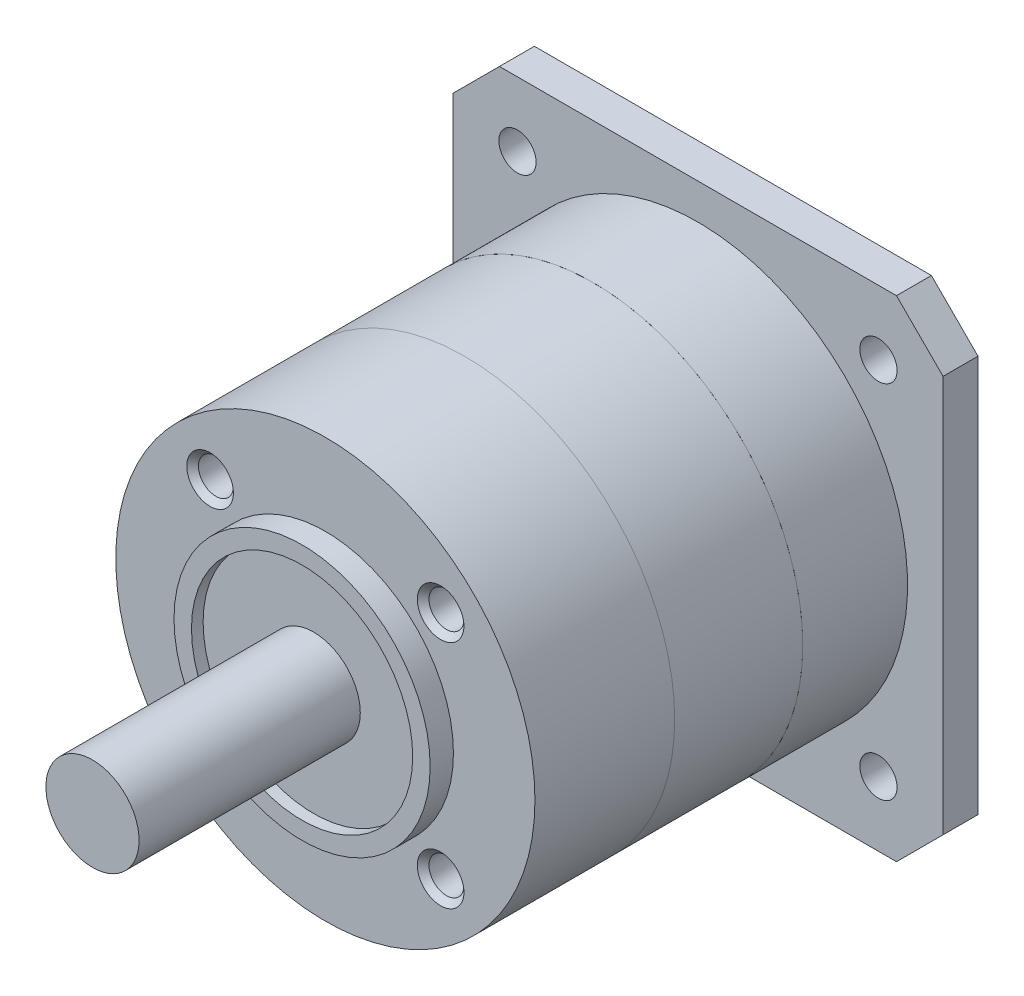
ISO-10303-21;
HEADER;
FILE_DESCRIPTION(('STEP AP214'),'2;1');
FILE_NAME('part.step','',(''),(''),'','','');
FILE_SCHEMA(('AUTOMOTIVE_DESIGN { 1 0 10303 214 1 1 1 1 }'));
ENDSEC;
DATA;
#1=APPLICATION_CONTEXT('core data for automotive mechanical design processes');
#2=APPLICATION_PROTOCOL_DEFINITION('international standard','automotive_design',2000,#1);
#3=PRODUCT_CONTEXT('',#1,'mechanical');
#4=PRODUCT('Part','Part','',(#3));
#5=PRODUCT_RELATED_PRODUCT_CATEGORY('part','',(#4));
#6=PRODUCT_DEFINITION_FORMATION('','',#4);
#7=PRODUCT_DEFINITION_CONTEXT('part definition',#1,'design');
#8=PRODUCT_DEFINITION('design','',#6,#7);
#9=PRODUCT_DEFINITION_SHAPE('','',#8);
#10=(LENGTH_UNIT() NAMED_UNIT(*) SI_UNIT(.MILLI.,.METRE.));
#11=(NAMED_UNIT(*) PLANE_ANGLE_UNIT() SI_UNIT($,.RADIAN.));
#12=(NAMED_UNIT(*) SI_UNIT($,.STERADIAN.) SOLID_ANGLE_UNIT());
#13=UNCERTAINTY_MEASURE_WITH_UNIT(LENGTH_MEASURE(1.E-05),#10,'distance_accuracy_value','');
#14=(GEOMETRIC_REPRESENTATION_CONTEXT(3) GLOBAL_UNCERTAINTY_ASSIGNED_CONTEXT((#13)) GLOBAL_UNIT_ASSIGNED_CONTEXT((#10,
#11,#12)) REPRESENTATION_CONTEXT('',''));
#15=CARTESIAN_POINT('',(0.,0.,0.));
#16=DIRECTION('',(0.,0.,1.));
#17=DIRECTION('',(1.,0.,0.));
#18=AXIS2_PLACEMENT_3D('',#15,#16,#17);
#19=CARTESIAN_POINT('',(0.,0.,55.));
#20=DIRECTION('',(0.,0.,-1.));
#21=DIRECTION('',(-1.,0.,0.));
#22=AXIS2_PLACEMENT_3D('',#19,#20,#21);
#23=CYLINDRICAL_SURFACE('',#22,4.);
#24=CARTESIAN_POINT('',(0.,0.,55.));
#25=DIRECTION('',(0.,0.,1.));
#26=DIRECTION('',(1.,0.,0.));
#27=AXIS2_PLACEMENT_3D('',#24,#25,#26);
#28=CIRCLE('',#27,4.);
#29=CARTESIAN_POINT('',(4.,0.,55.));
#30=VERTEX_POINT('',#29);
#31=EDGE_CURVE('E11',#30,#30,#28,.T.);
#32=ORIENTED_EDGE('',*,*,#31,.F.);
#33=EDGE_LOOP('',(#32));
#34=FACE_BOUND('',#33,.T.);
#35=CARTESIAN_POINT('',(0.,0.,35.));
#36=DIRECTION('',(0.,0.,1.));
#37=DIRECTION('',(1.,0.,0.));
#38=AXIS2_PLACEMENT_3D('',#35,#36,#37);
#39=CIRCLE('',#38,4.);
#40=CARTESIAN_POINT('',(4.,0.,35.));
#41=VERTEX_POINT('',#40);
#42=EDGE_CURVE('E49',#41,#41,#39,.T.);
#43=ORIENTED_EDGE('',*,*,#42,.T.);
#44=EDGE_LOOP('',(#43));
#45=FACE_BOUND('',#44,.T.);
#46=ADVANCED_FACE('F46',(#34,#45),#23,.T.);
#47=CARTESIAN_POINT('',(0.,0.,55.));
#48=DIRECTION('',(0.,0.,1.));
#49=DIRECTION('',(1.,0.,0.));
#50=AXIS2_PLACEMENT_3D('',#47,#48,#49);
#51=PLANE('',#50);
#52=ORIENTED_EDGE('',*,*,#31,.T.);
#53=EDGE_LOOP('',(#52));
#54=FACE_BOUND('',#53,.T.);
#55=ADVANCED_FACE('F61',(#54),#51,.T.);
#56=CARTESIAN_POINT('',(0.,0.,35.));
#57=DIRECTION('',(0.,0.,1.));
#58=DIRECTION('',(1.,0.,0.));
#59=AXIS2_PLACEMENT_3D('',#56,#57,#58);
#60=PLANE('',#59);
#61=ORIENTED_EDGE('',*,*,#42,.F.);
#62=EDGE_LOOP('',(#61));
#63=FACE_BOUND('',#62,.T.);
#64=ADVANCED_FACE('F59',(#63),#60,.F.);
#65=CLOSED_SHELL('',(#46,#55,#64));
#66=MANIFOLD_SOLID_BREP('B2',#65);
#67=CARTESIAN_POINT('',(0.,0.,120.911688245431));
#68=DIRECTION('',(0.,0.,-1.));
#69=DIRECTION('',(-1.,0.,0.));
#70=AXIS2_PLACEMENT_3D('',#67,#68,#69);
#71=CYLINDRICAL_SURFACE('',#70,18.);
#72=CARTESIAN_POINT('',(0.,0.,23.));
#73=DIRECTION('',(0.,0.,1.));
#74=DIRECTION('',(1.,0.,0.));
#75=AXIS2_PLACEMENT_3D('',#72,#73,#74);
#76=CIRCLE('',#75,18.);
#77=CARTESIAN_POINT('',(18.,0.,23.));
#78=VERTEX_POINT('',#77);
#79=EDGE_CURVE('E133',#78,#78,#76,.T.);
#80=ORIENTED_EDGE('',*,*,#79,.T.);
#81=EDGE_LOOP('',(#80));
#82=FACE_BOUND('',#81,.T.);
#83=CARTESIAN_POINT('',(0.,0.,35.));
#84=DIRECTION('',(0.,0.,1.));
#85=DIRECTION('',(1.,0.,0.));
#86=AXIS2_PLACEMENT_3D('',#83,#84,#85);
#87=CIRCLE('',#86,18.);
#88=CARTESIAN_POINT('',(18.,0.,35.));
#89=VERTEX_POINT('',#88);
#90=EDGE_CURVE('E130',#89,#89,#87,.T.);
#91=ORIENTED_EDGE('',*,*,#90,.F.);
#92=EDGE_LOOP('',(#91));
#93=FACE_BOUND('',#92,.T.);
#94=ADVANCED_FACE('F97',(#82,#93),#71,.T.);
#95=CARTESIAN_POINT('',(0.,0.,23.));
#96=DIRECTION('',(0.,0.,1.));
#97=DIRECTION('',(1.,0.,0.));
#98=AXIS2_PLACEMENT_3D('',#95,#96,#97);
#99=PLANE('',#98);
#100=ORIENTED_EDGE('',*,*,#79,.F.);
#101=EDGE_LOOP('',(#100));
#102=FACE_BOUND('',#101,.T.);
#103=ADVANCED_FACE('F177',(#102),#99,.F.);
#104=CARTESIAN_POINT('',(0.,0.,35.));
#105=DIRECTION('',(0.,0.,1.));
#106=DIRECTION('',(1.,0.,0.));
#107=AXIS2_PLACEMENT_3D('',#104,#105,#106);
#108=PLANE('',#107);
#109=CARTESIAN_POINT('',(-9.89949493661167,-9.89949493661167,35.));
#110=DIRECTION('',(0.,0.,1.));
#111=DIRECTION('',(1.,0.,0.));
#112=AXIS2_PLACEMENT_3D('',#109,#110,#111);
#113=CIRCLE('',#112,2.);
#114=CARTESIAN_POINT('',(-7.89949493661166,-9.89949493661167,35.));
#115=VERTEX_POINT('',#114);
#116=EDGE_CURVE('E112',#115,#115,#113,.F.);
#117=ORIENTED_EDGE('',*,*,#116,.T.);
#118=EDGE_LOOP('',(#117));
#119=FACE_BOUND('',#118,.T.);
#120=CARTESIAN_POINT('',(9.89949493661167,-9.89949493661166,35.));
#121=DIRECTION('',(0.,0.,1.));
#122=DIRECTION('',(1.,0.,0.));
#123=AXIS2_PLACEMENT_3D('',#120,#121,#122);
#124=CIRCLE('',#123,2.);
#125=CARTESIAN_POINT('',(11.8994949366117,-9.89949493661166,35.));
#126=VERTEX_POINT('',#125);
#127=EDGE_CURVE('E117',#126,#126,#124,.F.);
#128=ORIENTED_EDGE('',*,*,#127,.T.);
#129=EDGE_LOOP('',(#128));
#130=FACE_BOUND('',#129,.T.);
#131=CARTESIAN_POINT('',(9.89949493661167,9.89949493661167,35.));
#132=DIRECTION('',(0.,0.,1.));
#133=DIRECTION('',(1.,0.,0.));
#134=AXIS2_PLACEMENT_3D('',#131,#132,#133);
#135=CIRCLE('',#134,2.);
#136=CARTESIAN_POINT('',(11.8994949366117,9.89949493661167,35.));
#137=VERTEX_POINT('',#136);
#138=EDGE_CURVE('E120',#137,#137,#135,.F.);
#139=ORIENTED_EDGE('',*,*,#138,.T.);
#140=EDGE_LOOP('',(#139));
#141=FACE_BOUND('',#140,.T.);
#142=CARTESIAN_POINT('',(-9.89949493661167,9.89949493661167,35.));
#143=DIRECTION('',(0.,0.,1.));
#144=DIRECTION('',(1.,0.,0.));
#145=AXIS2_PLACEMENT_3D('',#142,#143,#144);
#146=CIRCLE('',#145,2.);
#147=CARTESIAN_POINT('',(-7.89949493661166,9.89949493661167,35.));
#148=VERTEX_POINT('',#147);
#149=EDGE_CURVE('E123',#148,#148,#146,.F.);
#150=ORIENTED_EDGE('',*,*,#149,.T.);
#151=EDGE_LOOP('',(#150));
#152=FACE_BOUND('',#151,.T.);
#153=CARTESIAN_POINT('',(0.,0.,35.));
#154=DIRECTION('',(0.,0.,1.));
#155=DIRECTION('',(1.,0.,0.));
#156=AXIS2_PLACEMENT_3D('',#153,#154,#155);
#157=CIRCLE('',#156,11.);
#158=CARTESIAN_POINT('',(11.,0.,35.));
#159=VERTEX_POINT('',#158);
#160=EDGE_CURVE('E129',#159,#159,#157,.T.);
#161=ORIENTED_EDGE('',*,*,#160,.F.);
#162=EDGE_LOOP('',(#161));
#163=FACE_BOUND('',#162,.T.);
#164=ORIENTED_EDGE('',*,*,#90,.T.);
#165=EDGE_LOOP('',(#164));
#166=FACE_BOUND('',#165,.T.);
#167=ADVANCED_FACE('F183',(#119,#130,#141,#152,#163,#166),#108,.T.);
#168=CARTESIAN_POINT('',(0.,0.,37.));
#169=DIRECTION('',(0.,0.,-1.));
#170=DIRECTION('',(-1.,0.,0.));
#171=AXIS2_PLACEMENT_3D('',#168,#169,#170);
#172=CYLINDRICAL_SURFACE('',#171,11.);
#173=CARTESIAN_POINT('',(0.,0.,37.));
#174=DIRECTION('',(0.,0.,1.));
#175=DIRECTION('',(1.,0.,0.));
#176=AXIS2_PLACEMENT_3D('',#173,#174,#175);
#177=CIRCLE('',#176,11.);
#178=CARTESIAN_POINT('',(11.,0.,37.));
#179=VERTEX_POINT('',#178);
#180=EDGE_CURVE('E136',#179,#179,#177,.T.);
#181=ORIENTED_EDGE('',*,*,#180,.F.);
#182=EDGE_LOOP('',(#181));
#183=FACE_BOUND('',#182,.T.);
#184=ORIENTED_EDGE('',*,*,#160,.T.);
#185=EDGE_LOOP('',(#184));
#186=FACE_BOUND('',#185,.T.);
#187=ADVANCED_FACE('F191',(#183,#186),#172,.T.);
#188=CARTESIAN_POINT('',(0.,0.,37.));
#189=DIRECTION('',(0.,0.,1.));
#190=DIRECTION('',(1.,0.,0.));
#191=AXIS2_PLACEMENT_3D('',#188,#189,#190);
#192=PLANE('',#191);
#193=CARTESIAN_POINT('',(0.,0.,37.));
#194=DIRECTION('',(0.,0.,1.));
#195=DIRECTION('',(1.,0.,0.));
#196=AXIS2_PLACEMENT_3D('',#193,#194,#195);
#197=CIRCLE('',#196,9.5);
#198=CARTESIAN_POINT('',(9.5,0.,37.));
#199=VERTEX_POINT('',#198);
#200=EDGE_CURVE('E142',#199,#199,#197,.T.);
#201=ORIENTED_EDGE('',*,*,#200,.F.);
#202=EDGE_LOOP('',(#201));
#203=FACE_BOUND('',#202,.T.);
#204=ORIENTED_EDGE('',*,*,#180,.T.);
#205=EDGE_LOOP('',(#204));
#206=FACE_BOUND('',#205,.T.);
#207=ADVANCED_FACE('F219',(#203,#206),#192,.T.);
#208=CARTESIAN_POINT('',(0.,0.,36.));
#209=DIRECTION('',(0.,0.,1.));
#210=DIRECTION('',(1.,0.,0.));
#211=AXIS2_PLACEMENT_3D('',#208,#209,#210);
#212=CYLINDRICAL_SURFACE('',#211,9.5);
#213=CARTESIAN_POINT('',(0.,0.,36.));
#214=DIRECTION('',(0.,0.,1.));
#215=DIRECTION('',(1.,0.,0.));
#216=AXIS2_PLACEMENT_3D('',#213,#214,#215);
#217=CIRCLE('',#216,9.5);
#218=CARTESIAN_POINT('',(9.5,0.,36.));
#219=VERTEX_POINT('',#218);
#220=EDGE_CURVE('E141',#219,#219,#217,.T.);
#221=ORIENTED_EDGE('',*,*,#220,.F.);
#222=EDGE_LOOP('',(#221));
#223=FACE_BOUND('',#222,.T.);
#224=ORIENTED_EDGE('',*,*,#200,.T.);
#225=EDGE_LOOP('',(#224));
#226=FACE_BOUND('',#225,.T.);
#227=ADVANCED_FACE('F224',(#223,#226),#212,.F.);
#228=CARTESIAN_POINT('',(0.,0.,36.));
#229=DIRECTION('',(0.,0.,1.));
#230=DIRECTION('',(1.,0.,0.));
#231=AXIS2_PLACEMENT_3D('',#228,#229,#230);
#232=PLANE('',#231);
#233=ORIENTED_EDGE('',*,*,#220,.T.);
#234=EDGE_LOOP('',(#233));
#235=FACE_BOUND('',#234,.T.);
#236=ADVANCED_FACE('F231',(#235),#232,.T.);
#237=CARTESIAN_POINT('',(-9.89949493661167,9.89949493661167,25.));
#238=DIRECTION('',(0.,0.,1.));
#239=DIRECTION('',(1.,0.,0.));
#240=AXIS2_PLACEMENT_3D('',#237,#238,#239);
#241=CYLINDRICAL_SURFACE('',#240,1.5);
#242=CARTESIAN_POINT('',(-9.89949493661167,9.89949493661167,34.5));
#243=DIRECTION('',(0.,0.,1.));
#244=DIRECTION('',(1.,0.,0.));
#245=AXIS2_PLACEMENT_3D('',#242,#243,#244);
#246=CIRCLE('',#245,1.5);
#247=CARTESIAN_POINT('',(-8.39949493661167,9.89949493661167,34.5));
#248=VERTEX_POINT('',#247);
#249=EDGE_CURVE('E45',#248,#248,#246,.T.);
#250=ORIENTED_EDGE('',*,*,#249,.T.);
#251=EDGE_LOOP('',(#250));
#252=FACE_BOUND('',#251,.T.);
#253=CARTESIAN_POINT('',(-9.89949493661167,9.89949493661167,25.));
#254=DIRECTION('',(0.,0.,1.));
#255=DIRECTION('',(1.,0.,0.));
#256=AXIS2_PLACEMENT_3D('',#253,#254,#255);
#257=CIRCLE('',#256,1.5);
#258=CARTESIAN_POINT('',(-8.39949493661167,9.89949493661167,25.));
#259=VERTEX_POINT('',#258);
#260=EDGE_CURVE('E145',#259,#259,#257,.T.);
#261=ORIENTED_EDGE('',*,*,#260,.F.);
#262=EDGE_LOOP('',(#261));
#263=FACE_BOUND('',#262,.T.);
#264=ADVANCED_FACE('F172',(#252,#263),#241,.F.);
#265=CARTESIAN_POINT('',(-9.89949493661167,9.89949493661167,25.));
#266=DIRECTION('',(0.,0.,1.));
#267=DIRECTION('',(1.,0.,0.));
#268=AXIS2_PLACEMENT_3D('',#265,#266,#267);
#269=PLANE('',#268);
#270=ORIENTED_EDGE('',*,*,#260,.T.);
#271=EDGE_LOOP('',(#270));
#272=FACE_BOUND('',#271,.T.);
#273=ADVANCED_FACE('F164',(#272),#269,.T.);
#274=CARTESIAN_POINT('',(9.89949493661167,9.89949493661167,25.));
#275=DIRECTION('',(0.,0.,1.));
#276=DIRECTION('',(1.,0.,0.));
#277=AXIS2_PLACEMENT_3D('',#274,#275,#276);
#278=CYLINDRICAL_SURFACE('',#277,1.5);
#279=CARTESIAN_POINT('',(9.89949493661167,9.89949493661167,34.5));
#280=DIRECTION('',(0.,0.,1.));
#281=DIRECTION('',(1.,0.,0.));
#282=AXIS2_PLACEMENT_3D('',#279,#280,#281);
#283=CIRCLE('',#282,1.5);
#284=CARTESIAN_POINT('',(11.3994949366117,9.89949493661167,34.5));
#285=VERTEX_POINT('',#284);
#286=EDGE_CURVE('E104',#285,#285,#283,.T.);
#287=ORIENTED_EDGE('',*,*,#286,.T.);
#288=EDGE_LOOP('',(#287));
#289=FACE_BOUND('',#288,.T.);
#290=CARTESIAN_POINT('',(9.89949493661167,9.89949493661167,25.));
#291=DIRECTION('',(0.,0.,1.));
#292=DIRECTION('',(1.,0.,0.));
#293=AXIS2_PLACEMENT_3D('',#290,#291,#292);
#294=CIRCLE('',#293,1.5);
#295=CARTESIAN_POINT('',(11.3994949366117,9.89949493661167,25.));
#296=VERTEX_POINT('',#295);
#297=EDGE_CURVE('E150',#296,#296,#294,.T.);
#298=ORIENTED_EDGE('',*,*,#297,.F.);
#299=EDGE_LOOP('',(#298));
#300=FACE_BOUND('',#299,.T.);
#301=ADVANCED_FACE('F162',(#289,#300),#278,.F.);
#302=CARTESIAN_POINT('',(9.89949493661167,9.89949493661167,25.));
#303=DIRECTION('',(0.,0.,1.));
#304=DIRECTION('',(1.,0.,0.));
#305=AXIS2_PLACEMENT_3D('',#302,#303,#304);
#306=PLANE('',#305);
#307=ORIENTED_EDGE('',*,*,#297,.T.);
#308=EDGE_LOOP('',(#307));
#309=FACE_BOUND('',#308,.T.);
#310=ADVANCED_FACE('F160',(#309),#306,.T.);
#311=CARTESIAN_POINT('',(9.89949493661167,-9.89949493661166,25.));
#312=DIRECTION('',(0.,0.,1.));
#313=DIRECTION('',(1.,0.,0.));
#314=AXIS2_PLACEMENT_3D('',#311,#312,#313);
#315=CYLINDRICAL_SURFACE('',#314,1.5);
#316=CARTESIAN_POINT('',(9.89949493661167,-9.89949493661166,34.5));
#317=DIRECTION('',(0.,0.,1.));
#318=DIRECTION('',(1.,0.,0.));
#319=AXIS2_PLACEMENT_3D('',#316,#317,#318);
#320=CIRCLE('',#319,1.5);
#321=CARTESIAN_POINT('',(11.3994949366117,-9.89949493661166,34.5));
#322=VERTEX_POINT('',#321);
#323=EDGE_CURVE('E108',#322,#322,#320,.T.);
#324=ORIENTED_EDGE('',*,*,#323,.T.);
#325=EDGE_LOOP('',(#324));
#326=FACE_BOUND('',#325,.T.);
#327=CARTESIAN_POINT('',(9.89949493661167,-9.89949493661166,25.));
#328=DIRECTION('',(0.,0.,1.));
#329=DIRECTION('',(1.,0.,0.));
#330=AXIS2_PLACEMENT_3D('',#327,#328,#329);
#331=CIRCLE('',#330,1.5);
#332=CARTESIAN_POINT('',(11.3994949366117,-9.89949493661166,25.));
#333=VERTEX_POINT('',#332);
#334=EDGE_CURVE('E154',#333,#333,#331,.T.);
#335=ORIENTED_EDGE('',*,*,#334,.F.);
#336=EDGE_LOOP('',(#335));
#337=FACE_BOUND('',#336,.T.);
#338=ADVANCED_FACE('F170',(#326,#337),#315,.F.);
#339=CARTESIAN_POINT('',(9.89949493661167,-9.89949493661166,25.));
#340=DIRECTION('',(0.,0.,1.));
#341=DIRECTION('',(1.,0.,0.));
#342=AXIS2_PLACEMENT_3D('',#339,#340,#341);
#343=PLANE('',#342);
#344=ORIENTED_EDGE('',*,*,#334,.T.);
#345=EDGE_LOOP('',(#344));
#346=FACE_BOUND('',#345,.T.);
#347=ADVANCED_FACE('F241',(#346),#343,.T.);
#348=CARTESIAN_POINT('',(-9.89949493661167,-9.89949493661167,25.));
#349=DIRECTION('',(0.,0.,1.));
#350=DIRECTION('',(1.,0.,0.));
#351=AXIS2_PLACEMENT_3D('',#348,#349,#350);
#352=CYLINDRICAL_SURFACE('',#351,1.5);
#353=CARTESIAN_POINT('',(-9.89949493661167,-9.89949493661167,34.5));
#354=DIRECTION('',(0.,0.,1.));
#355=DIRECTION('',(1.,0.,0.));
#356=AXIS2_PLACEMENT_3D('',#353,#354,#355);
#357=CIRCLE('',#356,1.5);
#358=CARTESIAN_POINT('',(-8.39949493661167,-9.89949493661167,34.5));
#359=VERTEX_POINT('',#358);
#360=EDGE_CURVE('E126',#359,#359,#357,.T.);
#361=ORIENTED_EDGE('',*,*,#360,.T.);
#362=EDGE_LOOP('',(#361));
#363=FACE_BOUND('',#362,.T.);
#364=CARTESIAN_POINT('',(-9.89949493661167,-9.89949493661167,25.));
#365=DIRECTION('',(0.,0.,1.));
#366=DIRECTION('',(1.,0.,0.));
#367=AXIS2_PLACEMENT_3D('',#364,#365,#366);
#368=CIRCLE('',#367,1.5);
#369=CARTESIAN_POINT('',(-8.39949493661167,-9.89949493661167,25.));
#370=VERTEX_POINT('',#369);
#371=EDGE_CURVE('E151',#370,#370,#368,.T.);
#372=ORIENTED_EDGE('',*,*,#371,.F.);
#373=EDGE_LOOP('',(#372));
#374=FACE_BOUND('',#373,.T.);
#375=ADVANCED_FACE('F238',(#363,#374),#352,.F.);
#376=CARTESIAN_POINT('',(-9.89949493661167,-9.89949493661167,25.));
#377=DIRECTION('',(0.,0.,1.));
#378=DIRECTION('',(1.,0.,0.));
#379=AXIS2_PLACEMENT_3D('',#376,#377,#378);
#380=PLANE('',#379);
#381=ORIENTED_EDGE('',*,*,#371,.T.);
#382=EDGE_LOOP('',(#381));
#383=FACE_BOUND('',#382,.T.);
#384=ADVANCED_FACE('F197',(#383),#380,.T.);
#385=CARTESIAN_POINT('',(-9.89949493661167,-9.89949493661167,34.5));
#386=DIRECTION('',(0.,0.,1.));
#387=DIRECTION('',(1.,0.,0.));
#388=AXIS2_PLACEMENT_3D('',#385,#386,#387);
#389=CONICAL_SURFACE('',#388,1.5,0.785398163397446);
#390=ORIENTED_EDGE('',*,*,#116,.F.);
#391=EDGE_LOOP('',(#390));
#392=FACE_BOUND('',#391,.T.);
#393=ORIENTED_EDGE('',*,*,#360,.F.);
#394=EDGE_LOOP('',(#393));
#395=FACE_BOUND('',#394,.T.);
#396=ADVANCED_FACE('F193',(#392,#395),#389,.F.);
#397=CARTESIAN_POINT('',(9.89949493661167,-9.89949493661166,34.5));
#398=DIRECTION('',(0.,0.,1.));
#399=DIRECTION('',(1.,0.,0.));
#400=AXIS2_PLACEMENT_3D('',#397,#398,#399);
#401=CONICAL_SURFACE('',#400,1.5,0.785398163397446);
#402=ORIENTED_EDGE('',*,*,#127,.F.);
#403=EDGE_LOOP('',(#402));
#404=FACE_BOUND('',#403,.T.);
#405=ORIENTED_EDGE('',*,*,#323,.F.);
#406=EDGE_LOOP('',(#405));
#407=FACE_BOUND('',#406,.T.);
#408=ADVANCED_FACE('F196',(#404,#407),#401,.F.);
#409=CARTESIAN_POINT('',(9.89949493661167,9.89949493661167,34.5));
#410=DIRECTION('',(0.,0.,1.));
#411=DIRECTION('',(1.,0.,0.));
#412=AXIS2_PLACEMENT_3D('',#409,#410,#411);
#413=CONICAL_SURFACE('',#412,1.5,0.785398163397446);
#414=ORIENTED_EDGE('',*,*,#138,.F.);
#415=EDGE_LOOP('',(#414));
#416=FACE_BOUND('',#415,.T.);
#417=ORIENTED_EDGE('',*,*,#286,.F.);
#418=EDGE_LOOP('',(#417));
#419=FACE_BOUND('',#418,.T.);
#420=ADVANCED_FACE('F200',(#416,#419),#413,.F.);
#421=CARTESIAN_POINT('',(-9.89949493661167,9.89949493661167,34.5));
#422=DIRECTION('',(0.,0.,1.));
#423=DIRECTION('',(1.,0.,0.));
#424=AXIS2_PLACEMENT_3D('',#421,#422,#423);
#425=CONICAL_SURFACE('',#424,1.5,0.785398163397446);
#426=ORIENTED_EDGE('',*,*,#149,.F.);
#427=EDGE_LOOP('',(#426));
#428=FACE_BOUND('',#427,.T.);
#429=ORIENTED_EDGE('',*,*,#249,.F.);
#430=EDGE_LOOP('',(#429));
#431=FACE_BOUND('',#430,.T.);
#432=ADVANCED_FACE('F99',(#428,#431),#425,.F.);
#433=CLOSED_SHELL('',(#94,#103,#167,#187,#207,#227,#236,#264,#273,#301,#310,#338,#347,#375,#384,
#396,#408,#420,#432));
#434=MANIFOLD_SOLID_BREP('B6',#433);
#435=CARTESIAN_POINT('',(0.,0.,96.9116882454314));
#436=DIRECTION('',(0.,0.,-1.));
#437=DIRECTION('',(-1.,0.,0.));
#438=AXIS2_PLACEMENT_3D('',#435,#436,#437);
#439=CYLINDRICAL_SURFACE('',#438,18.);
#440=CARTESIAN_POINT('',(0.,0.,12.));
#441=DIRECTION('',(0.,0.,1.));
#442=DIRECTION('',(1.,0.,0.));
#443=AXIS2_PLACEMENT_3D('',#440,#441,#442);
#444=CIRCLE('',#443,18.);
#445=CARTESIAN_POINT('',(18.,0.,12.));
#446=VERTEX_POINT('',#445);
#447=EDGE_CURVE('E397',#446,#446,#444,.T.);
#448=ORIENTED_EDGE('',*,*,#447,.T.);
#449=EDGE_LOOP('',(#448));
#450=FACE_BOUND('',#449,.T.);
#451=CARTESIAN_POINT('',(0.,0.,23.));
#452=DIRECTION('',(0.,0.,1.));
#453=DIRECTION('',(1.,0.,0.));
#454=AXIS2_PLACEMENT_3D('',#451,#452,#453);
#455=CIRCLE('',#454,18.);
#456=CARTESIAN_POINT('',(18.,0.,23.));
#457=VERTEX_POINT('',#456);
#458=EDGE_CURVE('E96',#457,#457,#455,.T.);
#459=ORIENTED_EDGE('',*,*,#458,.F.);
#460=EDGE_LOOP('',(#459));
#461=FACE_BOUND('',#460,.T.);
#462=ADVANCED_FACE('F390',(#450,#461),#439,.T.);
#463=CARTESIAN_POINT('',(0.,0.,12.));
#464=DIRECTION('',(0.,0.,1.));
#465=DIRECTION('',(1.,0.,0.));
#466=AXIS2_PLACEMENT_3D('',#463,#464,#465);
#467=PLANE('',#466);
#468=ORIENTED_EDGE('',*,*,#447,.F.);
#469=EDGE_LOOP('',(#468));
#470=FACE_BOUND('',#469,.T.);
#471=ADVANCED_FACE('F405',(#470),#467,.F.);
#472=CARTESIAN_POINT('',(0.,0.,23.));
#473=DIRECTION('',(0.,0.,1.));
#474=DIRECTION('',(1.,0.,0.));
#475=AXIS2_PLACEMENT_3D('',#472,#473,#474);
#476=PLANE('',#475);
#477=ORIENTED_EDGE('',*,*,#458,.T.);
#478=EDGE_LOOP('',(#477));
#479=FACE_BOUND('',#478,.T.);
#480=ADVANCED_FACE('F392',(#479),#476,.T.);
#481=CLOSED_SHELL('',(#462,#471,#480));
#482=MANIFOLD_SOLID_BREP('B40',#481);
#483=CARTESIAN_POINT('',(-21.05,-21.05,3.));
#484=DIRECTION('',(1.,0.,0.));
#485=DIRECTION('',(0.,0.,-1.));
#486=AXIS2_PLACEMENT_3D('',#483,#484,#485);
#487=PLANE('',#486);
#488=DIRECTION('',(0.,-1.,0.));
#489=VECTOR('',#488,1.);
#490=CARTESIAN_POINT('',(-21.05,-21.05,0.));
#491=LINE('',#490,#489);
#492=CARTESIAN_POINT('',(-21.05,17.05,0.));
#493=VERTEX_POINT('',#492);
#494=CARTESIAN_POINT('',(-21.05,-17.05,0.));
#495=VERTEX_POINT('',#494);
#496=EDGE_CURVE('E531',#493,#495,#491,.T.);
#497=ORIENTED_EDGE('',*,*,#496,.T.);
#498=DIRECTION('',(0.,0.,1.));
#499=VECTOR('',#498,1.);
#500=CARTESIAN_POINT('',(-21.05,-17.05,3.));
#501=LINE('',#500,#499);
#502=CARTESIAN_POINT('',(-21.05,-17.05,3.));
#503=VERTEX_POINT('',#502);
#504=EDGE_CURVE('E553',#495,#503,#501,.T.);
#505=ORIENTED_EDGE('',*,*,#504,.T.);
#506=DIRECTION('',(0.,-1.,0.));
#507=VECTOR('',#506,1.);
#508=CARTESIAN_POINT('',(-21.05,-21.05,3.));
#509=LINE('',#508,#507);
#510=CARTESIAN_POINT('',(-21.05,17.05,3.));
#511=VERTEX_POINT('',#510);
#512=EDGE_CURVE('E529',#511,#503,#509,.T.);
#513=ORIENTED_EDGE('',*,*,#512,.F.);
#514=DIRECTION('',(0.,0.,-1.));
#515=VECTOR('',#514,1.);
#516=CARTESIAN_POINT('',(-21.05,17.05,3.));
#517=LINE('',#516,#515);
#518=EDGE_CURVE('E550',#511,#493,#517,.T.);
#519=ORIENTED_EDGE('',*,*,#518,.T.);
#520=EDGE_LOOP('',(#497,#505,#513,#519));
#521=FACE_BOUND('',#520,.T.);
#522=ADVANCED_FACE('F434',(#521),#487,.F.);
#523=CARTESIAN_POINT('',(21.05,-21.05,3.));
#524=DIRECTION('',(0.,1.,0.));
#525=DIRECTION('',(-1.,0.,0.));
#526=AXIS2_PLACEMENT_3D('',#523,#524,#525);
#527=PLANE('',#526);
#528=DIRECTION('',(1.,0.,0.));
#529=VECTOR('',#528,1.);
#530=CARTESIAN_POINT('',(21.05,-21.05,0.));
#531=LINE('',#530,#529);
#532=CARTESIAN_POINT('',(-17.05,-21.05,0.));
#533=VERTEX_POINT('',#532);
#534=CARTESIAN_POINT('',(17.05,-21.05,0.));
#535=VERTEX_POINT('',#534);
#536=EDGE_CURVE('E527',#533,#535,#531,.T.);
#537=ORIENTED_EDGE('',*,*,#536,.T.);
#538=DIRECTION('',(0.,0.,1.));
#539=VECTOR('',#538,1.);
#540=CARTESIAN_POINT('',(17.05,-21.05,3.));
#541=LINE('',#540,#539);
#542=CARTESIAN_POINT('',(17.05,-21.05,3.));
#543=VERTEX_POINT('',#542);
#544=EDGE_CURVE('E505',#535,#543,#541,.T.);
#545=ORIENTED_EDGE('',*,*,#544,.T.);
#546=DIRECTION('',(1.,0.,0.));
#547=VECTOR('',#546,1.);
#548=CARTESIAN_POINT('',(21.05,-21.05,3.));
#549=LINE('',#548,#547);
#550=CARTESIAN_POINT('',(-17.05,-21.05,3.));
#551=VERTEX_POINT('',#550);
#552=EDGE_CURVE('E567',#551,#543,#549,.T.);
#553=ORIENTED_EDGE('',*,*,#552,.F.);
#554=DIRECTION('',(0.,0.,-1.));
#555=VECTOR('',#554,1.);
#556=CARTESIAN_POINT('',(-17.05,-21.05,3.));
#557=LINE('',#556,#555);
#558=EDGE_CURVE('E510',#551,#533,#557,.T.);
#559=ORIENTED_EDGE('',*,*,#558,.T.);
#560=EDGE_LOOP('',(#537,#545,#553,#559));
#561=FACE_BOUND('',#560,.T.);
#562=ADVANCED_FACE('F572',(#561),#527,.F.);
#563=CARTESIAN_POINT('',(21.05,-21.05,3.));
#564=DIRECTION('',(-1.,0.,0.));
#565=DIRECTION('',(0.,0.,1.));
#566=AXIS2_PLACEMENT_3D('',#563,#564,#565);
#567=PLANE('',#566);
#568=DIRECTION('',(0.,1.,0.));
#569=VECTOR('',#568,1.);
#570=CARTESIAN_POINT('',(21.05,-21.05,3.));
#571=LINE('',#570,#569);
#572=CARTESIAN_POINT('',(21.05,-17.05,3.));
#573=VERTEX_POINT('',#572);
#574=CARTESIAN_POINT('',(21.05,17.05,3.));
#575=VERTEX_POINT('',#574);
#576=EDGE_CURVE('E519',#573,#575,#571,.T.);
#577=ORIENTED_EDGE('',*,*,#576,.F.);
#578=DIRECTION('',(0.,0.,-1.));
#579=VECTOR('',#578,1.);
#580=CARTESIAN_POINT('',(21.05,-17.05,3.));
#581=LINE('',#580,#579);
#582=CARTESIAN_POINT('',(21.05,-17.05,0.));
#583=VERTEX_POINT('',#582);
#584=EDGE_CURVE('E504',#573,#583,#581,.T.);
#585=ORIENTED_EDGE('',*,*,#584,.T.);
#586=DIRECTION('',(0.,1.,0.));
#587=VECTOR('',#586,1.);
#588=CARTESIAN_POINT('',(21.05,-21.05,0.));
#589=LINE('',#588,#587);
#590=CARTESIAN_POINT('',(21.05,17.05,0.));
#591=VERTEX_POINT('',#590);
#592=EDGE_CURVE('E517',#583,#591,#589,.T.);
#593=ORIENTED_EDGE('',*,*,#592,.T.);
#594=DIRECTION('',(0.,0.,1.));
#595=VECTOR('',#594,1.);
#596=CARTESIAN_POINT('',(21.05,17.05,3.));
#597=LINE('',#596,#595);
#598=EDGE_CURVE('E521',#591,#575,#597,.T.);
#599=ORIENTED_EDGE('',*,*,#598,.T.);
#600=EDGE_LOOP('',(#577,#585,#593,#599));
#601=FACE_BOUND('',#600,.T.);
#602=ADVANCED_FACE('F516',(#601),#567,.F.);
#603=CARTESIAN_POINT('',(21.05,21.05,3.));
#604=DIRECTION('',(0.,-1.,0.));
#605=DIRECTION('',(1.,0.,0.));
#606=AXIS2_PLACEMENT_3D('',#603,#604,#605);
#607=PLANE('',#606);
#608=DIRECTION('',(-1.,0.,0.));
#609=VECTOR('',#608,1.);
#610=CARTESIAN_POINT('',(21.05,21.05,3.));
#611=LINE('',#610,#609);
#612=CARTESIAN_POINT('',(17.05,21.05,3.));
#613=VERTEX_POINT('',#612);
#614=CARTESIAN_POINT('',(-17.05,21.05,3.));
#615=VERTEX_POINT('',#614);
#616=EDGE_CURVE('E578',#613,#615,#611,.T.);
#617=ORIENTED_EDGE('',*,*,#616,.F.);
#618=DIRECTION('',(0.,0.,-1.));
#619=VECTOR('',#618,1.);
#620=CARTESIAN_POINT('',(17.05,21.05,3.));
#621=LINE('',#620,#619);
#622=CARTESIAN_POINT('',(17.05,21.05,0.));
#623=VERTEX_POINT('',#622);
#624=EDGE_CURVE('E388',#613,#623,#621,.T.);
#625=ORIENTED_EDGE('',*,*,#624,.T.);
#626=DIRECTION('',(-1.,0.,0.));
#627=VECTOR('',#626,1.);
#628=CARTESIAN_POINT('',(21.05,21.05,0.));
#629=LINE('',#628,#627);
#630=CARTESIAN_POINT('',(-17.05,21.05,0.));
#631=VERTEX_POINT('',#630);
#632=EDGE_CURVE('E526',#623,#631,#629,.T.);
#633=ORIENTED_EDGE('',*,*,#632,.T.);
#634=DIRECTION('',(0.,0.,1.));
#635=VECTOR('',#634,1.);
#636=CARTESIAN_POINT('',(-17.05,21.05,3.));
#637=LINE('',#636,#635);
#638=EDGE_CURVE('E442',#631,#615,#637,.T.);
#639=ORIENTED_EDGE('',*,*,#638,.T.);
#640=EDGE_LOOP('',(#617,#625,#633,#639));
#641=FACE_BOUND('',#640,.T.);
#642=ADVANCED_FACE('F672',(#641),#607,.F.);
#643=CARTESIAN_POINT('',(0.,0.,3.));
#644=DIRECTION('',(0.,0.,1.));
#645=DIRECTION('',(1.,0.,0.));
#646=AXIS2_PLACEMENT_3D('',#643,#644,#645);
#647=PLANE('',#646);
#648=CARTESIAN_POINT('',(15.5,-15.5,3.));
#649=DIRECTION('',(0.,0.,1.));
#650=DIRECTION('',(1.,0.,0.));
#651=AXIS2_PLACEMENT_3D('',#648,#649,#650);
#652=CIRCLE('',#651,1.6);
#653=CARTESIAN_POINT('',(17.1,-15.5,3.));
#654=VERTEX_POINT('',#653);
#655=EDGE_CURVE('E590',#654,#654,#652,.F.);
#656=ORIENTED_EDGE('',*,*,#655,.T.);
#657=EDGE_LOOP('',(#656));
#658=FACE_BOUND('',#657,.T.);
#659=CARTESIAN_POINT('',(-15.5,-15.5,3.));
#660=DIRECTION('',(0.,0.,1.));
#661=DIRECTION('',(1.,0.,0.));
#662=AXIS2_PLACEMENT_3D('',#659,#660,#661);
#663=CIRCLE('',#662,1.6);
#664=CARTESIAN_POINT('',(-13.9,-15.5,3.));
#665=VERTEX_POINT('',#664);
#666=EDGE_CURVE('E597',#665,#665,#663,.F.);
#667=ORIENTED_EDGE('',*,*,#666,.T.);
#668=EDGE_LOOP('',(#667));
#669=FACE_BOUND('',#668,.T.);
#670=CARTESIAN_POINT('',(-15.5,15.5,3.));
#671=DIRECTION('',(0.,0.,1.));
#672=DIRECTION('',(1.,0.,0.));
#673=AXIS2_PLACEMENT_3D('',#670,#671,#672);
#674=CIRCLE('',#673,1.6);
#675=CARTESIAN_POINT('',(-13.9,15.5,3.));
#676=VERTEX_POINT('',#675);
#677=EDGE_CURVE('E603',#676,#676,#674,.F.);
#678=ORIENTED_EDGE('',*,*,#677,.T.);
#679=EDGE_LOOP('',(#678));
#680=FACE_BOUND('',#679,.T.);
#681=CARTESIAN_POINT('',(15.5,15.5,3.));
#682=DIRECTION('',(0.,0.,1.));
#683=DIRECTION('',(1.,0.,0.));
#684=AXIS2_PLACEMENT_3D('',#681,#682,#683);
#685=CIRCLE('',#684,1.6);
#686=CARTESIAN_POINT('',(17.1,15.5,3.));
#687=VERTEX_POINT('',#686);
#688=EDGE_CURVE('E584',#687,#687,#685,.F.);
#689=ORIENTED_EDGE('',*,*,#688,.T.);
#690=EDGE_LOOP('',(#689));
#691=FACE_BOUND('',#690,.T.);
#692=CARTESIAN_POINT('',(0.,0.,3.));
#693=DIRECTION('',(0.,0.,1.));
#694=DIRECTION('',(1.,0.,0.));
#695=AXIS2_PLACEMENT_3D('',#692,#693,#694);
#696=CIRCLE('',#695,18.);
#697=CARTESIAN_POINT('',(-18.,0.,2.99999999999999));
#698=VERTEX_POINT('',#697);
#699=EDGE_CURVE('E535',#698,#698,#696,.T.);
#700=ORIENTED_EDGE('',*,*,#699,.F.);
#701=EDGE_LOOP('',(#700));
#702=FACE_BOUND('',#701,.T.);
#703=ORIENTED_EDGE('',*,*,#552,.T.);
#704=DIRECTION('',(-0.707106781186549,-0.707106781186546,0.));
#705=VECTOR('',#704,1.);
#706=CARTESIAN_POINT('',(19.05,-19.05,3.));
#707=LINE('',#706,#705);
#708=EDGE_CURVE('E548',#543,#573,#707,.F.);
#709=ORIENTED_EDGE('',*,*,#708,.T.);
#710=ORIENTED_EDGE('',*,*,#576,.T.);
#711=DIRECTION('',(0.707106781186546,-0.707106781186549,0.));
#712=VECTOR('',#711,1.);
#713=CARTESIAN_POINT('',(19.05,19.05,3.));
#714=LINE('',#713,#712);
#715=EDGE_CURVE('E455',#575,#613,#714,.F.);
#716=ORIENTED_EDGE('',*,*,#715,.T.);
#717=ORIENTED_EDGE('',*,*,#616,.T.);
#718=DIRECTION('',(0.707106781186549,0.707106781186546,0.));
#719=VECTOR('',#718,1.);
#720=CARTESIAN_POINT('',(-19.05,19.05,3.));
#721=LINE('',#720,#719);
#722=EDGE_CURVE('E543',#615,#511,#721,.F.);
#723=ORIENTED_EDGE('',*,*,#722,.T.);
#724=ORIENTED_EDGE('',*,*,#512,.T.);
#725=DIRECTION('',(-0.707106781186546,0.707106781186549,0.));
#726=VECTOR('',#725,1.);
#727=CARTESIAN_POINT('',(-19.05,-19.05,3.));
#728=LINE('',#727,#726);
#729=EDGE_CURVE('E546',#503,#551,#728,.F.);
#730=ORIENTED_EDGE('',*,*,#729,.T.);
#731=EDGE_LOOP('',(#703,#709,#710,#716,#717,#723,#724,#730));
#732=FACE_BOUND('',#731,.T.);
#733=ADVANCED_FACE('F564',(#658,#669,#680,#691,#702,#732),#647,.T.);
#734=CARTESIAN_POINT('',(0.,0.,0.));
#735=DIRECTION('',(0.,0.,1.));
#736=DIRECTION('',(1.,0.,0.));
#737=AXIS2_PLACEMENT_3D('',#734,#735,#736);
#738=PLANE('',#737);
#739=CARTESIAN_POINT('',(0.,0.,0.));
#740=DIRECTION('',(0.,0.,-1.));
#741=DIRECTION('',(-1.,0.,0.));
#742=AXIS2_PLACEMENT_3D('',#739,#740,#741);
#743=CIRCLE('',#742,11.);
#744=CARTESIAN_POINT('',(-11.,0.,0.));
#745=VERTEX_POINT('',#744);
#746=EDGE_CURVE('E608',#745,#745,#743,.T.);
#747=ORIENTED_EDGE('',*,*,#746,.F.);
#748=EDGE_LOOP('',(#747));
#749=FACE_BOUND('',#748,.T.);
#750=CARTESIAN_POINT('',(15.5,-15.5,0.));
#751=DIRECTION('',(0.,0.,-1.));
#752=DIRECTION('',(-1.,0.,0.));
#753=AXIS2_PLACEMENT_3D('',#750,#751,#752);
#754=CIRCLE('',#753,1.6);
#755=CARTESIAN_POINT('',(13.9,-15.5,0.));
#756=VERTEX_POINT('',#755);
#757=EDGE_CURVE('E593',#756,#756,#754,.T.);
#758=ORIENTED_EDGE('',*,*,#757,.F.);
#759=EDGE_LOOP('',(#758));
#760=FACE_BOUND('',#759,.T.);
#761=CARTESIAN_POINT('',(-15.5,-15.5,0.));
#762=DIRECTION('',(0.,0.,-1.));
#763=DIRECTION('',(-1.,0.,0.));
#764=AXIS2_PLACEMENT_3D('',#761,#762,#763);
#765=CIRCLE('',#764,1.6);
#766=CARTESIAN_POINT('',(-17.1,-15.5,0.));
#767=VERTEX_POINT('',#766);
#768=EDGE_CURVE('E600',#767,#767,#765,.T.);
#769=ORIENTED_EDGE('',*,*,#768,.F.);
#770=EDGE_LOOP('',(#769));
#771=FACE_BOUND('',#770,.T.);
#772=CARTESIAN_POINT('',(-15.5,15.5,0.));
#773=DIRECTION('',(0.,0.,-1.));
#774=DIRECTION('',(-1.,0.,0.));
#775=AXIS2_PLACEMENT_3D('',#772,#773,#774);
#776=CIRCLE('',#775,1.6);
#777=CARTESIAN_POINT('',(-17.1,15.5,0.));
#778=VERTEX_POINT('',#777);
#779=EDGE_CURVE('E587',#778,#778,#776,.T.);
#780=ORIENTED_EDGE('',*,*,#779,.F.);
#781=EDGE_LOOP('',(#780));
#782=FACE_BOUND('',#781,.T.);
#783=CARTESIAN_POINT('',(15.5,15.5,0.));
#784=DIRECTION('',(0.,0.,-1.));
#785=DIRECTION('',(-1.,0.,0.));
#786=AXIS2_PLACEMENT_3D('',#783,#784,#785);
#787=CIRCLE('',#786,1.6);
#788=CARTESIAN_POINT('',(13.9,15.5,0.));
#789=VERTEX_POINT('',#788);
#790=EDGE_CURVE('E575',#789,#789,#787,.T.);
#791=ORIENTED_EDGE('',*,*,#790,.F.);
#792=EDGE_LOOP('',(#791));
#793=FACE_BOUND('',#792,.T.);
#794=ORIENTED_EDGE('',*,*,#592,.F.);
#795=DIRECTION('',(0.707106781186549,0.707106781186546,0.));
#796=VECTOR('',#795,1.);
#797=CARTESIAN_POINT('',(21.05,-17.05,0.));
#798=LINE('',#797,#796);
#799=EDGE_CURVE('E500',#583,#535,#798,.F.);
#800=ORIENTED_EDGE('',*,*,#799,.T.);
#801=ORIENTED_EDGE('',*,*,#536,.F.);
#802=DIRECTION('',(0.707106781186546,-0.707106781186549,0.));
#803=VECTOR('',#802,1.);
#804=CARTESIAN_POINT('',(-17.05,-21.05,0.));
#805=LINE('',#804,#803);
#806=EDGE_CURVE('E511',#533,#495,#805,.F.);
#807=ORIENTED_EDGE('',*,*,#806,.T.);
#808=ORIENTED_EDGE('',*,*,#496,.F.);
#809=DIRECTION('',(-0.707106781186549,-0.707106781186546,0.));
#810=VECTOR('',#809,1.);
#811=CARTESIAN_POINT('',(-21.05,17.05,0.));
#812=LINE('',#811,#810);
#813=EDGE_CURVE('E520',#493,#631,#812,.F.);
#814=ORIENTED_EDGE('',*,*,#813,.T.);
#815=ORIENTED_EDGE('',*,*,#632,.F.);
#816=DIRECTION('',(-0.707106781186546,0.707106781186549,0.));
#817=VECTOR('',#816,1.);
#818=CARTESIAN_POINT('',(17.05,21.05,0.));
#819=LINE('',#818,#817);
#820=EDGE_CURVE('E525',#623,#591,#819,.F.);
#821=ORIENTED_EDGE('',*,*,#820,.T.);
#822=EDGE_LOOP('',(#794,#800,#801,#807,#808,#814,#815,#821));
#823=FACE_BOUND('',#822,.T.);
#824=ADVANCED_FACE('F523',(#749,#760,#771,#782,#793,#823),#738,.F.);
#825=CARTESIAN_POINT('',(0.,0.,74.9116882454314));
#826=DIRECTION('',(0.,0.,-1.));
#827=DIRECTION('',(-1.,0.,0.));
#828=AXIS2_PLACEMENT_3D('',#825,#826,#827);
#829=CYLINDRICAL_SURFACE('',#828,18.);
#830=CARTESIAN_POINT('',(0.,0.,12.));
#831=DIRECTION('',(0.,0.,1.));
#832=DIRECTION('',(1.,0.,0.));
#833=AXIS2_PLACEMENT_3D('',#830,#831,#832);
#834=CIRCLE('',#833,18.);
#835=CARTESIAN_POINT('',(-18.,0.,12.));
#836=VERTEX_POINT('',#835);
#837=EDGE_CURVE('E573',#836,#836,#834,.T.);
#838=CARTESIAN_POINT('',(-18.,0.,2.99999999999999));
#839=CARTESIAN_POINT('',(-18.,0.,3.09374999999999));
#840=CARTESIAN_POINT('',(-18.,0.,3.18749999999999));
#841=CARTESIAN_POINT('',(-18.,0.,3.37499999999998));
#842=CARTESIAN_POINT('',(-18.,0.,3.46874999999998));
#843=CARTESIAN_POINT('',(-18.,0.,3.65624999999999));
#844=CARTESIAN_POINT('',(-18.,0.,3.74999999999999));
#845=CARTESIAN_POINT('',(-18.,0.,3.93749999999999));
#846=CARTESIAN_POINT('',(-18.,0.,4.03124999999999));
#847=CARTESIAN_POINT('',(-18.,0.,4.21874999999999));
#848=CARTESIAN_POINT('',(-18.,0.,4.31249999999999));
#849=CARTESIAN_POINT('',(-18.,0.,4.49999999999999));
#850=CARTESIAN_POINT('',(-18.,0.,4.59374999999999));
#851=CARTESIAN_POINT('',(-18.,0.,4.78125));
#852=CARTESIAN_POINT('',(-18.,0.,4.87499999999999));
#853=CARTESIAN_POINT('',(-18.,0.,5.06249999999999));
#854=CARTESIAN_POINT('',(-18.,0.,5.15624999999999));
#855=CARTESIAN_POINT('',(-18.,0.,5.34374999999999));
#856=CARTESIAN_POINT('',(-18.,0.,5.43749999999999));
#857=CARTESIAN_POINT('',(-18.,0.,5.62499999999999));
#858=CARTESIAN_POINT('',(-18.,0.,5.71874999999998));
#859=CARTESIAN_POINT('',(-18.,0.,5.90624999999999));
#860=CARTESIAN_POINT('',(-18.,0.,5.99999999999999));
#861=CARTESIAN_POINT('',(-18.,0.,6.18749999999999));
#862=CARTESIAN_POINT('',(-18.,0.,6.28124999999999));
#863=CARTESIAN_POINT('',(-18.,0.,6.46874999999999));
#864=CARTESIAN_POINT('',(-18.,0.,6.56249999999999));
#865=CARTESIAN_POINT('',(-18.,0.,6.74999999999999));
#866=CARTESIAN_POINT('',(-18.,0.,6.84375));
#867=CARTESIAN_POINT('',(-18.,0.,7.03125));
#868=CARTESIAN_POINT('',(-18.,0.,7.125));
#869=CARTESIAN_POINT('',(-18.,0.,7.3125));
#870=CARTESIAN_POINT('',(-18.,0.,7.40624999999999));
#871=CARTESIAN_POINT('',(-18.,0.,7.59374999999999));
#872=CARTESIAN_POINT('',(-18.,0.,7.68749999999999));
#873=CARTESIAN_POINT('',(-18.,0.,7.87499999999999));
#874=CARTESIAN_POINT('',(-18.,0.,7.96874999999999));
#875=CARTESIAN_POINT('',(-18.,0.,8.15624999999999));
#876=CARTESIAN_POINT('',(-18.,0.,8.24999999999999));
#877=CARTESIAN_POINT('',(-18.,0.,8.43749999999999));
#878=CARTESIAN_POINT('',(-18.,0.,8.53124999999999));
#879=CARTESIAN_POINT('',(-18.,0.,8.71874999999999));
#880=CARTESIAN_POINT('',(-18.,0.,8.81249999999999));
#881=CARTESIAN_POINT('',(-18.,0.,8.99999999999999));
#882=CARTESIAN_POINT('',(-18.,0.,9.09375));
#883=CARTESIAN_POINT('',(-18.,0.,9.28125));
#884=CARTESIAN_POINT('',(-18.,0.,9.375));
#885=CARTESIAN_POINT('',(-18.,0.,9.5625));
#886=CARTESIAN_POINT('',(-18.,0.,9.65625));
#887=CARTESIAN_POINT('',(-18.,0.,9.84374999999999));
#888=CARTESIAN_POINT('',(-18.,0.,9.93749999999999));
#889=CARTESIAN_POINT('',(-18.,0.,10.125));
#890=CARTESIAN_POINT('',(-18.,0.,10.21875));
#891=CARTESIAN_POINT('',(-18.,0.,10.40625));
#892=CARTESIAN_POINT('',(-18.,0.,10.5));
#893=CARTESIAN_POINT('',(-18.,0.,10.6875));
#894=CARTESIAN_POINT('',(-18.,0.,10.78125));
#895=CARTESIAN_POINT('',(-18.,0.,10.96875));
#896=CARTESIAN_POINT('',(-18.,0.,11.0625));
#897=CARTESIAN_POINT('',(-18.,0.,11.25));
#898=CARTESIAN_POINT('',(-18.,0.,11.34375));
#899=CARTESIAN_POINT('',(-18.,0.,11.53125));
#900=CARTESIAN_POINT('',(-18.,0.,11.625));
#901=CARTESIAN_POINT('',(-18.,0.,11.8125));
#902=CARTESIAN_POINT('',(-18.,0.,11.90625));
#903=CARTESIAN_POINT('',(-18.,0.,12.));
#904=B_SPLINE_CURVE_WITH_KNOTS('',3,(#838,#839,#840,#841,#842,#843,#844,#845,#846,#847,#848,
#849,#850,#851,#852,#853,#854,#855,#856,#857,#858,#859,#860,#861,#862,#863,#864,#865,#866,#867,
#868,#869,#870,#871,#872,#873,#874,#875,#876,#877,#878,#879,#880,#881,#882,#883,#884,#885,#886,
#887,#888,#889,#890,#891,#892,#893,#894,#895,#896,#897,#898,#899,#900,#901,#902,#903),
.UNSPECIFIED.,.F.,.F.,(4,2,2,2,2,2,2,2,2,2,2,2,2,2,2,2,2,2,2,2,2,2,2,2,2,2,2,2,2,2,2,2,4),(0.,
0.281249999999997,0.562499999999994,0.843750000000004,1.125,1.40625,1.68750000000001,
1.96875000000001,2.25,2.53125,2.8125,3.09375000000001,3.375,3.65625,3.93750000000001,
4.21875000000001,4.5,4.78125,5.0625,5.34375000000001,5.62500000000001,5.90625,6.18750000000001,
6.46875000000001,6.75000000000001,7.03125,7.3125,7.59375000000001,7.87500000000001,8.15625,
8.43750000000001,8.71875000000001,9.00000000000001),.UNSPECIFIED.);
#905=EDGE_CURVE('BSEAM624',#698,#836,#904,.T.);
#906=ORIENTED_EDGE('',*,*,#699,.T.);
#907=ORIENTED_EDGE('',*,*,#837,.F.);
#908=ORIENTED_EDGE('',*,*,#905,.T.);
#909=ORIENTED_EDGE('',*,*,#905,.F.);
#910=EDGE_LOOP('',(#906,#908,#907,#909));
#911=FACE_BOUND('',#910,.T.);
#912=ADVANCED_FACE('F624',(#911),#829,.T.);
#913=CARTESIAN_POINT('',(0.,0.,12.));
#914=DIRECTION('',(0.,0.,1.));
#915=DIRECTION('',(1.,0.,0.));
#916=AXIS2_PLACEMENT_3D('',#913,#914,#915);
#917=PLANE('',#916);
#918=ORIENTED_EDGE('',*,*,#837,.T.);
#919=EDGE_LOOP('',(#918));
#920=FACE_BOUND('',#919,.T.);
#921=ADVANCED_FACE('F637',(#920),#917,.T.);
#922=CARTESIAN_POINT('',(15.5,15.5,55.001));
#923=DIRECTION('',(0.,0.,-1.));
#924=DIRECTION('',(-1.,0.,0.));
#925=AXIS2_PLACEMENT_3D('',#922,#923,#924);
#926=CYLINDRICAL_SURFACE('',#925,1.6);
#927=ORIENTED_EDGE('',*,*,#688,.F.);
#928=EDGE_LOOP('',(#927));
#929=FACE_BOUND('',#928,.T.);
#930=ORIENTED_EDGE('',*,*,#790,.T.);
#931=EDGE_LOOP('',(#930));
#932=FACE_BOUND('',#931,.T.);
#933=ADVANCED_FACE('F634',(#929,#932),#926,.F.);
#934=CARTESIAN_POINT('',(-15.5,15.5,55.001));
#935=DIRECTION('',(0.,0.,-1.));
#936=DIRECTION('',(-1.,0.,0.));
#937=AXIS2_PLACEMENT_3D('',#934,#935,#936);
#938=CYLINDRICAL_SURFACE('',#937,1.6);
#939=ORIENTED_EDGE('',*,*,#677,.F.);
#940=EDGE_LOOP('',(#939));
#941=FACE_BOUND('',#940,.T.);
#942=ORIENTED_EDGE('',*,*,#779,.T.);
#943=EDGE_LOOP('',(#942));
#944=FACE_BOUND('',#943,.T.);
#945=ADVANCED_FACE('F636',(#941,#944),#938,.F.);
#946=CARTESIAN_POINT('',(-15.5,-15.5,55.001));
#947=DIRECTION('',(0.,0.,-1.));
#948=DIRECTION('',(-1.,0.,0.));
#949=AXIS2_PLACEMENT_3D('',#946,#947,#948);
#950=CYLINDRICAL_SURFACE('',#949,1.6);
#951=ORIENTED_EDGE('',*,*,#666,.F.);
#952=EDGE_LOOP('',(#951));
#953=FACE_BOUND('',#952,.T.);
#954=ORIENTED_EDGE('',*,*,#768,.T.);
#955=EDGE_LOOP('',(#954));
#956=FACE_BOUND('',#955,.T.);
#957=ADVANCED_FACE('F644',(#953,#956),#950,.F.);
#958=CARTESIAN_POINT('',(15.5,-15.5,55.001));
#959=DIRECTION('',(0.,0.,-1.));
#960=DIRECTION('',(-1.,0.,0.));
#961=AXIS2_PLACEMENT_3D('',#958,#959,#960);
#962=CYLINDRICAL_SURFACE('',#961,1.6);
#963=ORIENTED_EDGE('',*,*,#655,.F.);
#964=EDGE_LOOP('',(#963));
#965=FACE_BOUND('',#964,.T.);
#966=ORIENTED_EDGE('',*,*,#757,.T.);
#967=EDGE_LOOP('',(#966));
#968=FACE_BOUND('',#967,.T.);
#969=ADVANCED_FACE('F662',(#965,#968),#962,.F.);
#970=CARTESIAN_POINT('',(21.05,-17.05,3.));
#971=DIRECTION('',(-0.707106781186546,0.707106781186549,0.));
#972=DIRECTION('',(0.,0.,-1.));
#973=AXIS2_PLACEMENT_3D('',#970,#971,#972);
#974=PLANE('',#973);
#975=ORIENTED_EDGE('',*,*,#708,.F.);
#976=ORIENTED_EDGE('',*,*,#544,.F.);
#977=ORIENTED_EDGE('',*,*,#799,.F.);
#978=ORIENTED_EDGE('',*,*,#584,.F.);
#979=EDGE_LOOP('',(#975,#976,#977,#978));
#980=FACE_BOUND('',#979,.T.);
#981=ADVANCED_FACE('F503',(#980),#974,.F.);
#982=CARTESIAN_POINT('',(-17.05,-21.05,3.));
#983=DIRECTION('',(0.707106781186549,0.707106781186546,0.));
#984=DIRECTION('',(0.,0.,-1.));
#985=AXIS2_PLACEMENT_3D('',#982,#983,#984);
#986=PLANE('',#985);
#987=ORIENTED_EDGE('',*,*,#729,.F.);
#988=ORIENTED_EDGE('',*,*,#504,.F.);
#989=ORIENTED_EDGE('',*,*,#806,.F.);
#990=ORIENTED_EDGE('',*,*,#558,.F.);
#991=EDGE_LOOP('',(#987,#988,#989,#990));
#992=FACE_BOUND('',#991,.T.);
#993=ADVANCED_FACE('F570',(#992),#986,.F.);
#994=CARTESIAN_POINT('',(17.05,21.05,3.));
#995=DIRECTION('',(-0.707106781186549,-0.707106781186546,0.));
#996=DIRECTION('',(0.,0.,-1.));
#997=AXIS2_PLACEMENT_3D('',#994,#995,#996);
#998=PLANE('',#997);
#999=ORIENTED_EDGE('',*,*,#715,.F.);
#1000=ORIENTED_EDGE('',*,*,#598,.F.);
#1001=ORIENTED_EDGE('',*,*,#820,.F.);
#1002=ORIENTED_EDGE('',*,*,#624,.F.);
#1003=EDGE_LOOP('',(#999,#1000,#1001,#1002));
#1004=FACE_BOUND('',#1003,.T.);
#1005=ADVANCED_FACE('F664',(#1004),#998,.F.);
#1006=CARTESIAN_POINT('',(-21.05,17.05,3.));
#1007=DIRECTION('',(0.707106781186546,-0.707106781186549,0.));
#1008=DIRECTION('',(0.,0.,-1.));
#1009=AXIS2_PLACEMENT_3D('',#1006,#1007,#1008);
#1010=PLANE('',#1009);
#1011=ORIENTED_EDGE('',*,*,#722,.F.);
#1012=ORIENTED_EDGE('',*,*,#638,.F.);
#1013=ORIENTED_EDGE('',*,*,#813,.F.);
#1014=ORIENTED_EDGE('',*,*,#518,.F.);
#1015=EDGE_LOOP('',(#1011,#1012,#1013,#1014));
#1016=FACE_BOUND('',#1015,.T.);
#1017=ADVANCED_FACE('F436',(#1016),#1010,.F.);
#1018=CARTESIAN_POINT('',(0.,0.,1.5));
#1019=DIRECTION('',(0.,0.,-1.));
#1020=DIRECTION('',(-1.,0.,0.));
#1021=AXIS2_PLACEMENT_3D('',#1018,#1019,#1020);
#1022=CYLINDRICAL_SURFACE('',#1021,11.);
#1023=CARTESIAN_POINT('',(0.,0.,1.5));
#1024=DIRECTION('',(0.,0.,-1.));
#1025=DIRECTION('',(-1.,0.,0.));
#1026=AXIS2_PLACEMENT_3D('',#1023,#1024,#1025);
#1027=CIRCLE('',#1026,11.);
#1028=CARTESIAN_POINT('',(-11.,0.,1.5));
#1029=VERTEX_POINT('',#1028);
#1030=EDGE_CURVE('E594',#1029,#1029,#1027,.T.);
#1031=ORIENTED_EDGE('',*,*,#1030,.F.);
#1032=EDGE_LOOP('',(#1031));
#1033=FACE_BOUND('',#1032,.T.);
#1034=ORIENTED_EDGE('',*,*,#746,.T.);
#1035=EDGE_LOOP('',(#1034));
#1036=FACE_BOUND('',#1035,.T.);
#1037=ADVANCED_FACE('F616',(#1033,#1036),#1022,.F.);
#1038=CARTESIAN_POINT('',(0.,0.,1.5));
#1039=DIRECTION('',(0.,0.,-1.));
#1040=DIRECTION('',(-1.,0.,0.));
#1041=AXIS2_PLACEMENT_3D('',#1038,#1039,#1040);
#1042=PLANE('',#1041);
#1043=ORIENTED_EDGE('',*,*,#1030,.T.);
#1044=EDGE_LOOP('',(#1043));
#1045=FACE_BOUND('',#1044,.T.);
#1046=ADVANCED_FACE('F614',(#1045),#1042,.T.);
#1047=CLOSED_SHELL('',(#522,#562,#602,#642,#733,#824,#912,#921,#933,#945,#957,#969,#981,#993,
#1005,#1017,#1037,#1046));
#1048=MANIFOLD_SOLID_BREP('B91',#1047);
#1049=ADVANCED_BREP_SHAPE_REPRESENTATION('',(#18,#66,#434,#482,#1048),#14);
#1050=SHAPE_DEFINITION_REPRESENTATION(#9,#1049);
ENDSEC;
END-ISO-10303-21;
